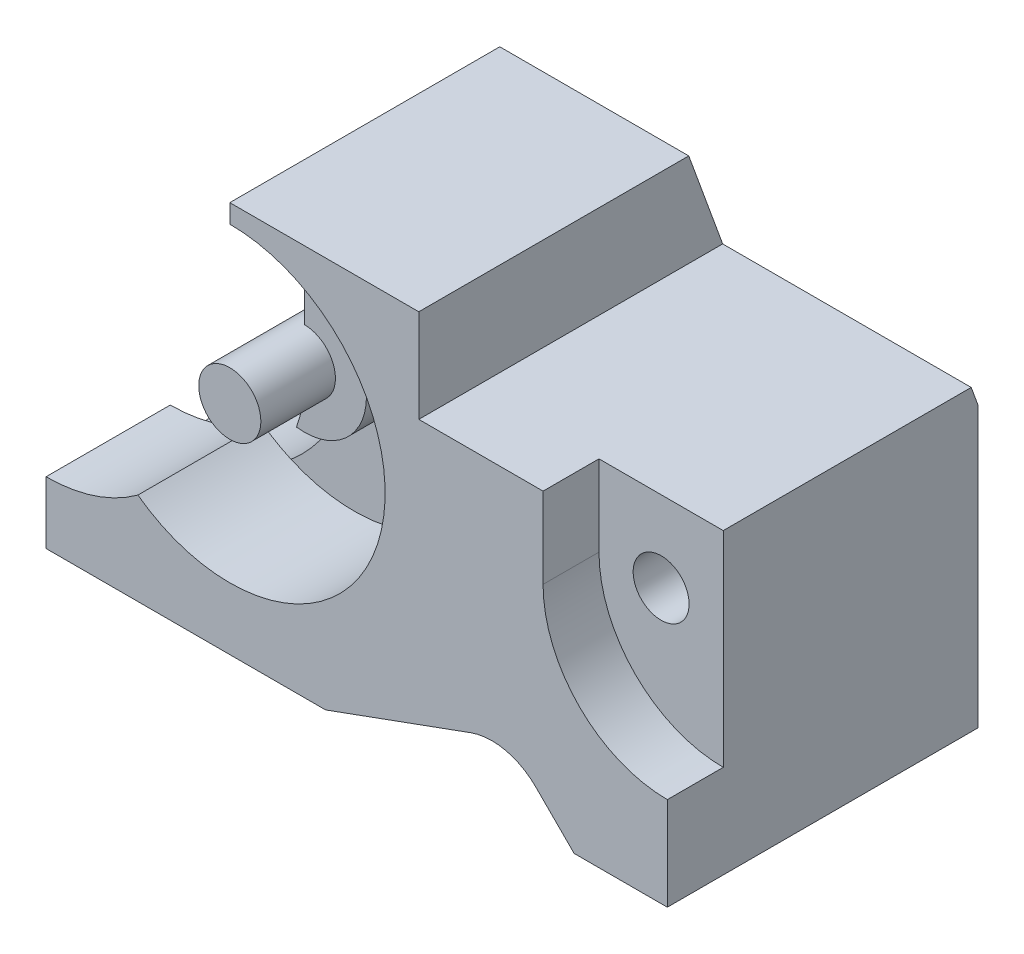
ISO-10303-21;
HEADER;
FILE_DESCRIPTION(('STEP AP214'),'2;1');
FILE_NAME('part.step','',(''),(''),'','','');
FILE_SCHEMA(('AUTOMOTIVE_DESIGN { 1 0 10303 214 1 1 1 1 }'));
ENDSEC;
DATA;
#1=APPLICATION_CONTEXT('core data for automotive mechanical design processes');
#2=APPLICATION_PROTOCOL_DEFINITION('international standard','automotive_design',2000,#1);
#3=PRODUCT_CONTEXT('',#1,'mechanical');
#4=PRODUCT('Part','Part','',(#3));
#5=PRODUCT_RELATED_PRODUCT_CATEGORY('part','',(#4));
#6=PRODUCT_DEFINITION_FORMATION('','',#4);
#7=PRODUCT_DEFINITION_CONTEXT('part definition',#1,'design');
#8=PRODUCT_DEFINITION('design','',#6,#7);
#9=PRODUCT_DEFINITION_SHAPE('','',#8);
#10=(LENGTH_UNIT() NAMED_UNIT(*) SI_UNIT(.MILLI.,.METRE.));
#11=(NAMED_UNIT(*) PLANE_ANGLE_UNIT() SI_UNIT($,.RADIAN.));
#12=(NAMED_UNIT(*) SI_UNIT($,.STERADIAN.) SOLID_ANGLE_UNIT());
#13=UNCERTAINTY_MEASURE_WITH_UNIT(LENGTH_MEASURE(1.E-05),#10,'distance_accuracy_value','');
#14=(GEOMETRIC_REPRESENTATION_CONTEXT(3) GLOBAL_UNCERTAINTY_ASSIGNED_CONTEXT((#13)) GLOBAL_UNIT_ASSIGNED_CONTEXT((#10,
#11,#12)) REPRESENTATION_CONTEXT('',''));
#15=CARTESIAN_POINT('',(0.,0.,0.));
#16=DIRECTION('',(0.,0.,1.));
#17=DIRECTION('',(1.,0.,0.));
#18=AXIS2_PLACEMENT_3D('',#15,#16,#17);
#19=CARTESIAN_POINT('',(0.,0.,50.));
#20=DIRECTION('',(-1.,0.,0.));
#21=DIRECTION('',(0.,0.,1.));
#22=AXIS2_PLACEMENT_3D('',#19,#20,#21);
#23=PLANE('',#22);
#24=DIRECTION('',(0.,-1.,0.));
#25=VECTOR('',#24,1.);
#26=CARTESIAN_POINT('',(2.61861100413235E-13,10.,30.));
#27=LINE('',#26,#25);
#28=CARTESIAN_POINT('',(0.,10.,30.));
#29=VERTEX_POINT('',#28);
#30=CARTESIAN_POINT('',(0.,5.,30.));
#31=VERTEX_POINT('',#30);
#32=EDGE_CURVE('E116',#29,#31,#27,.T.);
#33=ORIENTED_EDGE('',*,*,#32,.T.);
#34=DIRECTION('',(0.,0.,-1.));
#35=VECTOR('',#34,1.);
#36=CARTESIAN_POINT('',(0.,5.,30.));
#37=LINE('',#36,#35);
#38=CARTESIAN_POINT('',(0.,5.,0.));
#39=VERTEX_POINT('',#38);
#40=EDGE_CURVE('E454',#31,#39,#37,.T.);
#41=ORIENTED_EDGE('',*,*,#40,.T.);
#42=DIRECTION('',(0.,1.,0.));
#43=VECTOR('',#42,1.);
#44=CARTESIAN_POINT('',(0.,0.,0.));
#45=LINE('',#44,#43);
#46=CARTESIAN_POINT('',(0.,0.,0.));
#47=VERTEX_POINT('',#46);
#48=EDGE_CURVE('E423',#47,#39,#45,.T.);
#49=ORIENTED_EDGE('',*,*,#48,.F.);
#50=DIRECTION('',(0.,0.,-1.));
#51=VECTOR('',#50,1.);
#52=CARTESIAN_POINT('',(0.,0.,50.));
#53=LINE('',#52,#51);
#54=CARTESIAN_POINT('',(0.,0.,50.));
#55=VERTEX_POINT('',#54);
#56=EDGE_CURVE('E304',#55,#47,#53,.T.);
#57=ORIENTED_EDGE('',*,*,#56,.F.);
#58=DIRECTION('',(0.,1.,0.));
#59=VECTOR('',#58,1.);
#60=CARTESIAN_POINT('',(0.,0.,50.));
#61=LINE('',#60,#59);
#62=CARTESIAN_POINT('',(0.,10.,50.));
#63=VERTEX_POINT('',#62);
#64=EDGE_CURVE('E388',#55,#63,#61,.T.);
#65=ORIENTED_EDGE('',*,*,#64,.T.);
#66=DIRECTION('',(0.,0.,-1.));
#67=VECTOR('',#66,1.);
#68=CARTESIAN_POINT('',(0.,10.,50.));
#69=LINE('',#68,#67);
#70=EDGE_CURVE('E306',#63,#29,#69,.T.);
#71=ORIENTED_EDGE('',*,*,#70,.T.);
#72=EDGE_LOOP('',(#33,#41,#49,#57,#65,#71));
#73=FACE_BOUND('',#72,.T.);
#74=ADVANCED_FACE('F92',(#73),#23,.T.);
#75=CARTESIAN_POINT('',(0.,0.,0.));
#76=DIRECTION('',(0.,0.,1.));
#77=DIRECTION('',(1.,0.,0.));
#78=AXIS2_PLACEMENT_3D('',#75,#76,#77);
#79=PLANE('',#78);
#80=CARTESIAN_POINT('',(90.,35.,0.));
#81=DIRECTION('',(0.,0.,1.));
#82=DIRECTION('',(1.,0.,0.));
#83=AXIS2_PLACEMENT_3D('',#80,#81,#82);
#84=CIRCLE('',#83,4.50000000000001);
#85=CARTESIAN_POINT('',(94.5,35.,0.));
#86=VERTEX_POINT('',#85);
#87=EDGE_CURVE('E482',#86,#86,#84,.T.);
#88=ORIENTED_EDGE('',*,*,#87,.T.);
#89=EDGE_LOOP('',(#88));
#90=FACE_BOUND('',#89,.T.);
#91=DIRECTION('',(0.,1.,0.));
#92=VECTOR('',#91,1.);
#93=CARTESIAN_POINT('',(29.5803989154981,0.,0.));
#94=LINE('',#93,#92);
#95=CARTESIAN_POINT('',(29.5803989154981,40.,0.));
#96=VERTEX_POINT('',#95);
#97=CARTESIAN_POINT('',(29.5803989154981,45.,0.));
#98=VERTEX_POINT('',#97);
#99=EDGE_CURVE('E264',#96,#98,#94,.T.);
#100=ORIENTED_EDGE('',*,*,#99,.T.);
#101=DIRECTION('',(1.,0.,0.));
#102=VECTOR('',#101,1.);
#103=CARTESIAN_POINT('',(0.,45.,0.));
#104=LINE('',#103,#102);
#105=CARTESIAN_POINT('',(100.,45.,0.));
#106=VERTEX_POINT('',#105);
#107=EDGE_CURVE('E247',#98,#106,#104,.T.);
#108=ORIENTED_EDGE('',*,*,#107,.T.);
#109=DIRECTION('',(0.,-1.,0.));
#110=VECTOR('',#109,1.);
#111=CARTESIAN_POINT('',(100.,0.,0.));
#112=LINE('',#111,#110);
#113=CARTESIAN_POINT('',(100.,0.,0.));
#114=VERTEX_POINT('',#113);
#115=EDGE_CURVE('E265',#106,#114,#112,.T.);
#116=ORIENTED_EDGE('',*,*,#115,.T.);
#117=DIRECTION('',(-1.,0.,0.));
#118=VECTOR('',#117,1.);
#119=CARTESIAN_POINT('',(0.,0.,0.));
#120=LINE('',#119,#118);
#121=CARTESIAN_POINT('',(85.,0.,0.));
#122=VERTEX_POINT('',#121);
#123=EDGE_CURVE('E273',#114,#122,#120,.T.);
#124=ORIENTED_EDGE('',*,*,#123,.T.);
#125=DIRECTION('',(-0.707106781186553,0.707106781186542,0.));
#126=VECTOR('',#125,1.);
#127=CARTESIAN_POINT('',(42.4999999999994,42.5,0.));
#128=LINE('',#127,#126);
#129=CARTESIAN_POINT('',(78.8309201781926,6.16907982180732,0.));
#130=VERTEX_POINT('',#129);
#131=EDGE_CURVE('E283',#122,#130,#128,.T.);
#132=ORIENTED_EDGE('',*,*,#131,.T.);
#133=CARTESIAN_POINT('',(71.7598523663272,-0.901987990058188,0.));
#134=DIRECTION('',(0.,0.,1.));
#135=DIRECTION('',(1.,0.,0.));
#136=AXIS2_PLACEMENT_3D('',#133,#134,#135);
#137=CIRCLE('',#136,9.99999999999999);
#138=CARTESIAN_POINT('',(68.3396509330705,8.49493821780092,0.));
#139=VERTEX_POINT('',#138);
#140=EDGE_CURVE('E435',#139,#130,#137,.F.);
#141=ORIENTED_EDGE('',*,*,#140,.F.);
#142=DIRECTION('',(0.93969262078591,0.342020143325663,0.));
#143=VECTOR('',#142,1.);
#144=CARTESIAN_POINT('',(5.26400002982283,-14.4627212179469,0.));
#145=LINE('',#144,#143);
#146=CARTESIAN_POINT('',(45.,0.,0.));
#147=VERTEX_POINT('',#146);
#148=EDGE_CURVE('E427',#147,#139,#145,.T.);
#149=ORIENTED_EDGE('',*,*,#148,.F.);
#150=DIRECTION('',(1.,0.,0.));
#151=VECTOR('',#150,1.);
#152=CARTESIAN_POINT('',(0.,0.,0.));
#153=LINE('',#152,#151);
#154=EDGE_CURVE('E422',#47,#147,#153,.T.);
#155=ORIENTED_EDGE('',*,*,#154,.F.);
#156=ORIENTED_EDGE('',*,*,#48,.T.);
#157=CARTESIAN_POINT('',(0.,35.,0.));
#158=DIRECTION('',(0.,0.,1.));
#159=DIRECTION('',(1.,0.,0.));
#160=AXIS2_PLACEMENT_3D('',#157,#158,#159);
#161=CIRCLE('',#160,30.);
#162=CARTESIAN_POINT('',(29.5803989154981,30.,0.));
#163=VERTEX_POINT('',#162);
#164=EDGE_CURVE('E336',#163,#39,#161,.F.);
#165=ORIENTED_EDGE('',*,*,#164,.F.);
#166=CARTESIAN_POINT('',(29.5803989154981,35.,0.));
#167=DIRECTION('',(0.,0.,1.));
#168=DIRECTION('',(1.,0.,0.));
#169=AXIS2_PLACEMENT_3D('',#166,#167,#168);
#170=CIRCLE('',#169,5.);
#171=EDGE_CURVE('E372',#96,#163,#170,.T.);
#172=ORIENTED_EDGE('',*,*,#171,.F.);
#173=EDGE_LOOP('',(#100,#108,#116,#124,#132,#141,#149,#155,#156,#165,#172));
#174=FACE_BOUND('',#173,.T.);
#175=ADVANCED_FACE('F257',(#90,#174),#79,.F.);
#176=CARTESIAN_POINT('',(29.5803989154981,35.,50.));
#177=DIRECTION('',(0.,0.,-1.));
#178=DIRECTION('',(-1.,0.,0.));
#179=AXIS2_PLACEMENT_3D('',#176,#177,#178);
#180=CYLINDRICAL_SURFACE('',#179,25.);
#181=CARTESIAN_POINT('',(29.5803989154981,35.,30.));
#182=DIRECTION('',(0.,0.,1.));
#183=DIRECTION('',(1.,0.,0.));
#184=AXIS2_PLACEMENT_3D('',#181,#182,#183);
#185=CIRCLE('',#184,25.);
#186=CARTESIAN_POINT('',(19.4385478587559,12.1495545526382,30.));
#187=VERTEX_POINT('',#186);
#188=CARTESIAN_POINT('',(29.5803989154981,60.,30.));
#189=VERTEX_POINT('',#188);
#190=EDGE_CURVE('E478',#187,#189,#185,.T.);
#191=ORIENTED_EDGE('',*,*,#190,.F.);
#192=CARTESIAN_POINT('',(29.5803989154981,35.,30.));
#193=DIRECTION('',(0.,0.,-1.));
#194=DIRECTION('',(-1.,0.,0.));
#195=AXIS2_PLACEMENT_3D('',#192,#193,#194);
#196=CIRCLE('',#195,25.);
#197=CARTESIAN_POINT('',(14.790199457749,14.8443556292536,30.));
#198=VERTEX_POINT('',#197);
#199=EDGE_CURVE('E459',#187,#198,#196,.T.);
#200=ORIENTED_EDGE('',*,*,#199,.T.);
#201=DIRECTION('',(0.,0.,-1.));
#202=VECTOR('',#201,1.);
#203=CARTESIAN_POINT('',(14.790199457749,14.8443556292536,50.));
#204=LINE('',#203,#202);
#205=CARTESIAN_POINT('',(14.790199457749,14.8443556292536,50.));
#206=VERTEX_POINT('',#205);
#207=EDGE_CURVE('E315',#206,#198,#204,.T.);
#208=ORIENTED_EDGE('',*,*,#207,.F.);
#209=CARTESIAN_POINT('',(29.5803989154981,35.,50.));
#210=DIRECTION('',(0.,0.,1.));
#211=DIRECTION('',(1.,0.,0.));
#212=AXIS2_PLACEMENT_3D('',#209,#210,#211);
#213=CIRCLE('',#212,25.);
#214=CARTESIAN_POINT('',(29.5803989154981,60.,50.));
#215=VERTEX_POINT('',#214);
#216=EDGE_CURVE('E405',#206,#215,#213,.T.);
#217=ORIENTED_EDGE('',*,*,#216,.T.);
#218=DIRECTION('',(0.,0.,-1.));
#219=VECTOR('',#218,1.);
#220=CARTESIAN_POINT('',(29.5803989154981,60.,50.));
#221=LINE('',#220,#219);
#222=EDGE_CURVE('E316',#215,#189,#221,.T.);
#223=ORIENTED_EDGE('',*,*,#222,.T.);
#224=EDGE_LOOP('',(#191,#200,#208,#217,#223));
#225=FACE_BOUND('',#224,.T.);
#226=ADVANCED_FACE('F535',(#225),#180,.F.);
#227=CARTESIAN_POINT('',(0.,35.,50.));
#228=DIRECTION('',(0.,0.,-1.));
#229=DIRECTION('',(-1.,0.,0.));
#230=AXIS2_PLACEMENT_3D('',#227,#228,#229);
#231=CYLINDRICAL_SURFACE('',#230,25.);
#232=ORIENTED_EDGE('',*,*,#207,.T.);
#233=CARTESIAN_POINT('',(0.,35.,30.));
#234=DIRECTION('',(0.,0.,-1.));
#235=DIRECTION('',(-1.,0.,0.));
#236=AXIS2_PLACEMENT_3D('',#233,#234,#235);
#237=CIRCLE('',#236,25.);
#238=EDGE_CURVE('E102',#198,#29,#237,.T.);
#239=ORIENTED_EDGE('',*,*,#238,.T.);
#240=ORIENTED_EDGE('',*,*,#70,.F.);
#241=CARTESIAN_POINT('',(0.,35.,50.));
#242=DIRECTION('',(0.,0.,1.));
#243=DIRECTION('',(1.,0.,0.));
#244=AXIS2_PLACEMENT_3D('',#241,#242,#243);
#245=CIRCLE('',#244,25.);
#246=EDGE_CURVE('E396',#63,#206,#245,.T.);
#247=ORIENTED_EDGE('',*,*,#246,.T.);
#248=EDGE_LOOP('',(#232,#239,#240,#247));
#249=FACE_BOUND('',#248,.T.);
#250=ADVANCED_FACE('F385',(#249),#231,.F.);
#251=CARTESIAN_POINT('',(29.5803989154981,35.,50.));
#252=DIRECTION('',(0.,0.,-1.));
#253=DIRECTION('',(-1.,0.,0.));
#254=AXIS2_PLACEMENT_3D('',#251,#252,#253);
#255=CYLINDRICAL_SURFACE('',#254,5.);
#256=ORIENTED_EDGE('',*,*,#171,.T.);
#257=DIRECTION('',(0.,0.,-1.));
#258=VECTOR('',#257,1.);
#259=CARTESIAN_POINT('',(29.5803989154981,30.,38.));
#260=LINE('',#259,#258);
#261=CARTESIAN_POINT('',(29.5803989154981,30.,38.));
#262=VERTEX_POINT('',#261);
#263=EDGE_CURVE('E354',#262,#163,#260,.T.);
#264=ORIENTED_EDGE('',*,*,#263,.F.);
#265=CARTESIAN_POINT('',(29.5803989154981,35.,38.));
#266=DIRECTION('',(0.,0.,1.));
#267=DIRECTION('',(1.,0.,0.));
#268=AXIS2_PLACEMENT_3D('',#265,#266,#267);
#269=CIRCLE('',#268,5.);
#270=CARTESIAN_POINT('',(29.5803989154981,40.,38.));
#271=VERTEX_POINT('',#270);
#272=EDGE_CURVE('E348',#262,#271,#269,.T.);
#273=ORIENTED_EDGE('',*,*,#272,.T.);
#274=DIRECTION('',(0.,0.,-1.));
#275=VECTOR('',#274,1.);
#276=CARTESIAN_POINT('',(29.5803989154981,40.,38.));
#277=LINE('',#276,#275);
#278=EDGE_CURVE('E362',#271,#96,#277,.T.);
#279=ORIENTED_EDGE('',*,*,#278,.T.);
#280=EDGE_LOOP('',(#256,#264,#273,#279));
#281=FACE_BOUND('',#280,.T.);
#282=CARTESIAN_POINT('',(29.5803989154981,35.,50.));
#283=DIRECTION('',(0.,0.,1.));
#284=DIRECTION('',(1.,0.,0.));
#285=AXIS2_PLACEMENT_3D('',#282,#283,#284);
#286=CIRCLE('',#285,5.);
#287=CARTESIAN_POINT('',(34.5803989154981,35.,50.));
#288=VERTEX_POINT('',#287);
#289=EDGE_CURVE('E374',#288,#288,#286,.T.);
#290=ORIENTED_EDGE('',*,*,#289,.F.);
#291=EDGE_LOOP('',(#290));
#292=FACE_BOUND('',#291,.T.);
#293=ADVANCED_FACE('F100',(#281,#292),#255,.T.);
#294=CARTESIAN_POINT('',(0.,0.,50.));
#295=DIRECTION('',(0.,0.,1.));
#296=DIRECTION('',(1.,0.,0.));
#297=AXIS2_PLACEMENT_3D('',#294,#295,#296);
#298=PLANE('',#297);
#299=ORIENTED_EDGE('',*,*,#289,.T.);
#300=EDGE_LOOP('',(#299));
#301=FACE_BOUND('',#300,.T.);
#302=ADVANCED_FACE('F602',(#301),#298,.T.);
#303=CARTESIAN_POINT('',(0.,35.,38.));
#304=DIRECTION('',(0.,0.,-1.));
#305=DIRECTION('',(-1.,0.,0.));
#306=AXIS2_PLACEMENT_3D('',#303,#304,#305);
#307=CYLINDRICAL_SURFACE('',#306,30.);
#308=CARTESIAN_POINT('',(0.,35.,30.));
#309=DIRECTION('',(0.,0.,1.));
#310=DIRECTION('',(1.,0.,0.));
#311=AXIS2_PLACEMENT_3D('',#308,#309,#310);
#312=CIRCLE('',#311,30.);
#313=CARTESIAN_POINT('',(28.3126675334053,25.0806826271735,30.));
#314=VERTEX_POINT('',#313);
#315=EDGE_CURVE('E472',#314,#187,#312,.F.);
#316=ORIENTED_EDGE('',*,*,#315,.F.);
#317=DIRECTION('',(0.,0.,-1.));
#318=VECTOR('',#317,1.);
#319=CARTESIAN_POINT('',(28.3126675334053,25.0806826271735,38.));
#320=LINE('',#319,#318);
#321=CARTESIAN_POINT('',(28.3126675334053,25.0806826271735,38.));
#322=VERTEX_POINT('',#321);
#323=EDGE_CURVE('E367',#322,#314,#320,.T.);
#324=ORIENTED_EDGE('',*,*,#323,.F.);
#325=CARTESIAN_POINT('',(0.,35.,38.));
#326=DIRECTION('',(0.,0.,1.));
#327=DIRECTION('',(1.,0.,0.));
#328=AXIS2_PLACEMENT_3D('',#325,#326,#327);
#329=CIRCLE('',#328,30.);
#330=EDGE_CURVE('E339',#262,#322,#329,.F.);
#331=ORIENTED_EDGE('',*,*,#330,.F.);
#332=ORIENTED_EDGE('',*,*,#263,.T.);
#333=ORIENTED_EDGE('',*,*,#164,.T.);
#334=ORIENTED_EDGE('',*,*,#40,.F.);
#335=CARTESIAN_POINT('',(0.,35.,30.));
#336=DIRECTION('',(0.,0.,1.));
#337=DIRECTION('',(-1.,0.,0.));
#338=AXIS2_PLACEMENT_3D('',#335,#336,#337);
#339=CIRCLE('',#338,30.);
#340=EDGE_CURVE('E458',#31,#187,#339,.T.);
#341=ORIENTED_EDGE('',*,*,#340,.T.);
#342=EDGE_LOOP('',(#316,#324,#331,#332,#333,#334,#341));
#343=FACE_BOUND('',#342,.T.);
#344=ADVANCED_FACE('F546',(#343),#307,.F.);
#345=CARTESIAN_POINT('',(29.5803989154981,35.,38.));
#346=DIRECTION('',(0.,0.,-1.));
#347=DIRECTION('',(-1.,0.,0.));
#348=AXIS2_PLACEMENT_3D('',#345,#346,#347);
#349=CYLINDRICAL_SURFACE('',#348,10.);
#350=ORIENTED_EDGE('',*,*,#323,.T.);
#351=CARTESIAN_POINT('',(29.5803989154981,35.,30.));
#352=DIRECTION('',(0.,0.,1.));
#353=DIRECTION('',(1.,0.,0.));
#354=AXIS2_PLACEMENT_3D('',#351,#352,#353);
#355=CIRCLE('',#354,10.);
#356=CARTESIAN_POINT('',(29.5803989154981,45.,30.));
#357=VERTEX_POINT('',#356);
#358=EDGE_CURVE('E464',#314,#357,#355,.T.);
#359=ORIENTED_EDGE('',*,*,#358,.T.);
#360=DIRECTION('',(0.,0.,-1.));
#361=VECTOR('',#360,1.);
#362=CARTESIAN_POINT('',(29.5803989154981,45.,38.));
#363=LINE('',#362,#361);
#364=CARTESIAN_POINT('',(29.5803989154981,45.,38.));
#365=VERTEX_POINT('',#364);
#366=EDGE_CURVE('E368',#365,#357,#363,.T.);
#367=ORIENTED_EDGE('',*,*,#366,.F.);
#368=CARTESIAN_POINT('',(29.5803989154981,35.,38.));
#369=DIRECTION('',(0.,0.,1.));
#370=DIRECTION('',(1.,0.,0.));
#371=AXIS2_PLACEMENT_3D('',#368,#369,#370);
#372=CIRCLE('',#371,10.);
#373=EDGE_CURVE('E343',#322,#365,#372,.T.);
#374=ORIENTED_EDGE('',*,*,#373,.F.);
#375=EDGE_LOOP('',(#350,#359,#367,#374));
#376=FACE_BOUND('',#375,.T.);
#377=ADVANCED_FACE('F542',(#376),#349,.T.);
#378=CARTESIAN_POINT('',(29.5803989154981,0.,38.));
#379=DIRECTION('',(-1.,0.,0.));
#380=DIRECTION('',(0.,-1.,0.));
#381=AXIS2_PLACEMENT_3D('',#378,#379,#380);
#382=PLANE('',#381);
#383=DIRECTION('',(0.,0.939692620785908,0.342020143325669));
#384=VECTOR('',#383,1.);
#385=CARTESIAN_POINT('',(29.5803989154981,17.4769646138673,-10.0175656372077));
#386=LINE('',#385,#384);
#387=CARTESIAN_POINT('',(29.5803989154981,63.,6.55146421679165));
#388=VERTEX_POINT('',#387);
#389=EDGE_CURVE('E616',#98,#388,#386,.T.);
#390=ORIENTED_EDGE('',*,*,#389,.F.);
#391=ORIENTED_EDGE('',*,*,#99,.F.);
#392=ORIENTED_EDGE('',*,*,#278,.F.);
#393=DIRECTION('',(0.,1.,0.));
#394=VECTOR('',#393,1.);
#395=CARTESIAN_POINT('',(29.5803989154981,0.,38.));
#396=LINE('',#395,#394);
#397=EDGE_CURVE('E347',#271,#365,#396,.T.);
#398=ORIENTED_EDGE('',*,*,#397,.T.);
#399=ORIENTED_EDGE('',*,*,#366,.T.);
#400=DIRECTION('',(0.,1.,0.));
#401=VECTOR('',#400,1.);
#402=CARTESIAN_POINT('',(29.5803989154981,0.,30.));
#403=LINE('',#402,#401);
#404=EDGE_CURVE('E477',#357,#189,#403,.T.);
#405=ORIENTED_EDGE('',*,*,#404,.T.);
#406=ORIENTED_EDGE('',*,*,#222,.F.);
#407=DIRECTION('',(0.,1.,0.));
#408=VECTOR('',#407,1.);
#409=CARTESIAN_POINT('',(29.5803989154979,0.,50.));
#410=LINE('',#409,#408);
#411=CARTESIAN_POINT('',(29.5803989154981,63.,50.));
#412=VERTEX_POINT('',#411);
#413=EDGE_CURVE('E522',#215,#412,#410,.T.);
#414=ORIENTED_EDGE('',*,*,#413,.T.);
#415=DIRECTION('',(0.,0.,-1.));
#416=VECTOR('',#415,1.);
#417=CARTESIAN_POINT('',(29.5803989154981,63.,50.));
#418=LINE('',#417,#416);
#419=EDGE_CURVE('E317',#412,#388,#418,.T.);
#420=ORIENTED_EDGE('',*,*,#419,.T.);
#421=EDGE_LOOP('',(#390,#391,#392,#398,#399,#405,#406,#414,#420));
#422=FACE_BOUND('',#421,.T.);
#423=ADVANCED_FACE('F538',(#422),#382,.T.);
#424=CARTESIAN_POINT('',(0.,0.,38.));
#425=DIRECTION('',(0.,0.,1.));
#426=DIRECTION('',(1.,0.,0.));
#427=AXIS2_PLACEMENT_3D('',#424,#425,#426);
#428=PLANE('',#427);
#429=ORIENTED_EDGE('',*,*,#330,.T.);
#430=ORIENTED_EDGE('',*,*,#373,.T.);
#431=ORIENTED_EDGE('',*,*,#397,.F.);
#432=ORIENTED_EDGE('',*,*,#272,.F.);
#433=EDGE_LOOP('',(#429,#430,#431,#432));
#434=FACE_BOUND('',#433,.T.);
#435=ADVANCED_FACE('F595',(#434),#428,.T.);
#436=CARTESIAN_POINT('',(100.,35.,50.));
#437=DIRECTION('',(0.,0.,-1.));
#438=DIRECTION('',(-1.,0.,0.));
#439=AXIS2_PLACEMENT_3D('',#436,#437,#438);
#440=CYLINDRICAL_SURFACE('',#439,20.);
#441=CARTESIAN_POINT('',(100.,35.,41.));
#442=DIRECTION('',(0.,0.,1.));
#443=DIRECTION('',(1.,0.,0.));
#444=AXIS2_PLACEMENT_3D('',#441,#442,#443);
#445=CIRCLE('',#444,20.);
#446=CARTESIAN_POINT('',(80.,35.,41.));
#447=VERTEX_POINT('',#446);
#448=CARTESIAN_POINT('',(100.,15.,41.));
#449=VERTEX_POINT('',#448);
#450=EDGE_CURVE('E492',#447,#449,#445,.T.);
#451=ORIENTED_EDGE('',*,*,#450,.F.);
#452=DIRECTION('',(0.,0.,-1.));
#453=VECTOR('',#452,1.);
#454=CARTESIAN_POINT('',(80.,35.,50.));
#455=LINE('',#454,#453);
#456=CARTESIAN_POINT('',(80.,35.,50.));
#457=VERTEX_POINT('',#456);
#458=EDGE_CURVE('E333',#457,#447,#455,.T.);
#459=ORIENTED_EDGE('',*,*,#458,.F.);
#460=CARTESIAN_POINT('',(100.,35.,50.));
#461=DIRECTION('',(0.,0.,1.));
#462=DIRECTION('',(1.,0.,0.));
#463=AXIS2_PLACEMENT_3D('',#460,#461,#462);
#464=CIRCLE('',#463,20.);
#465=CARTESIAN_POINT('',(100.,15.,50.));
#466=VERTEX_POINT('',#465);
#467=EDGE_CURVE('E272',#457,#466,#464,.T.);
#468=ORIENTED_EDGE('',*,*,#467,.T.);
#469=DIRECTION('',(0.,0.,-1.));
#470=VECTOR('',#469,1.);
#471=CARTESIAN_POINT('',(100.,15.,50.));
#472=LINE('',#471,#470);
#473=EDGE_CURVE('E282',#466,#449,#472,.T.);
#474=ORIENTED_EDGE('',*,*,#473,.T.);
#475=EDGE_LOOP('',(#451,#459,#468,#474));
#476=FACE_BOUND('',#475,.T.);
#477=ADVANCED_FACE('F586',(#476),#440,.F.);
#478=CARTESIAN_POINT('',(80.,0.,50.));
#479=DIRECTION('',(1.,0.,0.));
#480=DIRECTION('',(0.,0.,-1.));
#481=AXIS2_PLACEMENT_3D('',#478,#479,#480);
#482=PLANE('',#481);
#483=DIRECTION('',(0.,-1.,0.));
#484=VECTOR('',#483,1.);
#485=CARTESIAN_POINT('',(80.,0.,41.));
#486=LINE('',#485,#484);
#487=CARTESIAN_POINT('',(80.,48.,41.));
#488=VERTEX_POINT('',#487);
#489=EDGE_CURVE('E487',#488,#447,#486,.T.);
#490=ORIENTED_EDGE('',*,*,#489,.F.);
#491=DIRECTION('',(0.,0.,-1.));
#492=VECTOR('',#491,1.);
#493=CARTESIAN_POINT('',(80.,48.,50.));
#494=LINE('',#493,#492);
#495=CARTESIAN_POINT('',(80.,48.,50.));
#496=VERTEX_POINT('',#495);
#497=EDGE_CURVE('E332',#496,#488,#494,.T.);
#498=ORIENTED_EDGE('',*,*,#497,.F.);
#499=DIRECTION('',(0.,-1.,0.));
#500=VECTOR('',#499,1.);
#501=CARTESIAN_POINT('',(80.,0.,50.));
#502=LINE('',#501,#500);
#503=EDGE_CURVE('E276',#496,#457,#502,.T.);
#504=ORIENTED_EDGE('',*,*,#503,.T.);
#505=ORIENTED_EDGE('',*,*,#458,.T.);
#506=EDGE_LOOP('',(#490,#498,#504,#505));
#507=FACE_BOUND('',#506,.T.);
#508=ADVANCED_FACE('F585',(#507),#482,.T.);
#509=CARTESIAN_POINT('',(0.,48.,50.));
#510=DIRECTION('',(0.,1.,0.));
#511=DIRECTION('',(0.,0.,1.));
#512=AXIS2_PLACEMENT_3D('',#509,#510,#511);
#513=PLANE('',#512);
#514=DIRECTION('',(1.,0.,0.));
#515=VECTOR('',#514,1.);
#516=CARTESIAN_POINT('',(0.,48.,1.09191070279861));
#517=LINE('',#516,#515);
#518=CARTESIAN_POINT('',(60.,48.,1.09191070279861));
#519=VERTEX_POINT('',#518);
#520=CARTESIAN_POINT('',(100.,48.,1.09191070279861));
#521=VERTEX_POINT('',#520);
#522=EDGE_CURVE('E252',#519,#521,#517,.T.);
#523=ORIENTED_EDGE('',*,*,#522,.F.);
#524=DIRECTION('',(0.,0.,-1.));
#525=VECTOR('',#524,1.);
#526=CARTESIAN_POINT('',(60.,48.,50.));
#527=LINE('',#526,#525);
#528=CARTESIAN_POINT('',(60.,48.,50.));
#529=VERTEX_POINT('',#528);
#530=EDGE_CURVE('E330',#529,#519,#527,.T.);
#531=ORIENTED_EDGE('',*,*,#530,.F.);
#532=DIRECTION('',(1.,0.,0.));
#533=VECTOR('',#532,1.);
#534=CARTESIAN_POINT('',(0.,48.,50.));
#535=LINE('',#534,#533);
#536=EDGE_CURVE('E511',#529,#496,#535,.T.);
#537=ORIENTED_EDGE('',*,*,#536,.T.);
#538=ORIENTED_EDGE('',*,*,#497,.T.);
#539=DIRECTION('',(1.,0.,0.));
#540=VECTOR('',#539,1.);
#541=CARTESIAN_POINT('',(0.,48.,41.));
#542=LINE('',#541,#540);
#543=CARTESIAN_POINT('',(100.,48.,41.));
#544=VERTEX_POINT('',#543);
#545=EDGE_CURVE('E503',#488,#544,#542,.T.);
#546=ORIENTED_EDGE('',*,*,#545,.T.);
#547=DIRECTION('',(0.,0.,-1.));
#548=VECTOR('',#547,1.);
#549=CARTESIAN_POINT('',(100.,48.,41.));
#550=LINE('',#549,#548);
#551=EDGE_CURVE('E426',#544,#521,#550,.T.);
#552=ORIENTED_EDGE('',*,*,#551,.T.);
#553=EDGE_LOOP('',(#523,#531,#537,#538,#546,#552));
#554=FACE_BOUND('',#553,.T.);
#555=ADVANCED_FACE('F579',(#554),#513,.T.);
#556=CARTESIAN_POINT('',(60.,0.,50.));
#557=DIRECTION('',(-1.,0.,0.));
#558=DIRECTION('',(0.,0.,1.));
#559=AXIS2_PLACEMENT_3D('',#556,#557,#558);
#560=PLANE('',#559);
#561=ORIENTED_EDGE('',*,*,#530,.T.);
#562=DIRECTION('',(0.,0.939692620785908,0.342020143325669));
#563=VECTOR('',#562,1.);
#564=CARTESIAN_POINT('',(60.,21.3336902719865,-8.61383229592159));
#565=LINE('',#564,#563);
#566=CARTESIAN_POINT('',(60.,63.,6.55146421679165));
#567=VERTEX_POINT('',#566);
#568=EDGE_CURVE('E12',#519,#567,#565,.T.);
#569=ORIENTED_EDGE('',*,*,#568,.T.);
#570=DIRECTION('',(0.,0.,-1.));
#571=VECTOR('',#570,1.);
#572=CARTESIAN_POINT('',(60.,63.,50.));
#573=LINE('',#572,#571);
#574=CARTESIAN_POINT('',(60.,63.,50.));
#575=VERTEX_POINT('',#574);
#576=EDGE_CURVE('E323',#575,#567,#573,.T.);
#577=ORIENTED_EDGE('',*,*,#576,.F.);
#578=DIRECTION('',(0.,1.,0.));
#579=VECTOR('',#578,1.);
#580=CARTESIAN_POINT('',(60.,0.,50.));
#581=LINE('',#580,#579);
#582=EDGE_CURVE('E520',#529,#575,#581,.T.);
#583=ORIENTED_EDGE('',*,*,#582,.F.);
#584=EDGE_LOOP('',(#561,#569,#577,#583));
#585=FACE_BOUND('',#584,.T.);
#586=ADVANCED_FACE('F576',(#585),#560,.F.);
#587=CARTESIAN_POINT('',(0.,63.,50.));
#588=DIRECTION('',(0.,1.,0.));
#589=DIRECTION('',(0.,0.,1.));
#590=AXIS2_PLACEMENT_3D('',#587,#588,#589);
#591=PLANE('',#590);
#592=DIRECTION('',(1.,0.,0.));
#593=VECTOR('',#592,1.);
#594=CARTESIAN_POINT('',(0.,63.,6.55146421679165));
#595=LINE('',#594,#593);
#596=EDGE_CURVE('E112',#388,#567,#595,.T.);
#597=ORIENTED_EDGE('',*,*,#596,.F.);
#598=ORIENTED_EDGE('',*,*,#419,.F.);
#599=DIRECTION('',(1.,0.,0.));
#600=VECTOR('',#599,1.);
#601=CARTESIAN_POINT('',(0.,63.,50.));
#602=LINE('',#601,#600);
#603=EDGE_CURVE('E517',#412,#575,#602,.T.);
#604=ORIENTED_EDGE('',*,*,#603,.T.);
#605=ORIENTED_EDGE('',*,*,#576,.T.);
#606=EDGE_LOOP('',(#597,#598,#604,#605));
#607=FACE_BOUND('',#606,.T.);
#608=ADVANCED_FACE('F571',(#607),#591,.T.);
#609=CARTESIAN_POINT('',(0.,0.,50.));
#610=DIRECTION('',(0.,1.,0.));
#611=DIRECTION('',(0.,0.,1.));
#612=AXIS2_PLACEMENT_3D('',#609,#610,#611);
#613=PLANE('',#612);
#614=ORIENTED_EDGE('',*,*,#154,.T.);
#615=DIRECTION('',(0.,0.,-1.));
#616=VECTOR('',#615,1.);
#617=CARTESIAN_POINT('',(45.,0.,50.));
#618=LINE('',#617,#616);
#619=CARTESIAN_POINT('',(45.,0.,50.));
#620=VERTEX_POINT('',#619);
#621=EDGE_CURVE('E301',#620,#147,#618,.T.);
#622=ORIENTED_EDGE('',*,*,#621,.F.);
#623=DIRECTION('',(1.,0.,0.));
#624=VECTOR('',#623,1.);
#625=CARTESIAN_POINT('',(0.,0.,50.));
#626=LINE('',#625,#624);
#627=EDGE_CURVE('E392',#55,#620,#626,.T.);
#628=ORIENTED_EDGE('',*,*,#627,.F.);
#629=ORIENTED_EDGE('',*,*,#56,.T.);
#630=EDGE_LOOP('',(#614,#622,#628,#629));
#631=FACE_BOUND('',#630,.T.);
#632=ADVANCED_FACE('F566',(#631),#613,.F.);
#633=CARTESIAN_POINT('',(5.26400002982283,-14.4627212179469,50.));
#634=DIRECTION('',(-0.342020143325663,0.93969262078591,0.));
#635=DIRECTION('',(-0.93969262078591,-0.342020143325663,0.));
#636=AXIS2_PLACEMENT_3D('',#633,#634,#635);
#637=PLANE('',#636);
#638=ORIENTED_EDGE('',*,*,#148,.T.);
#639=DIRECTION('',(0.,0.,-1.));
#640=VECTOR('',#639,1.);
#641=CARTESIAN_POINT('',(68.3396509330705,8.49493821780092,50.));
#642=LINE('',#641,#640);
#643=CARTESIAN_POINT('',(68.3396509330705,8.49493821780092,50.));
#644=VERTEX_POINT('',#643);
#645=EDGE_CURVE('E300',#644,#139,#642,.T.);
#646=ORIENTED_EDGE('',*,*,#645,.F.);
#647=DIRECTION('',(0.93969262078591,0.342020143325663,0.));
#648=VECTOR('',#647,1.);
#649=CARTESIAN_POINT('',(5.26400002982283,-14.4627212179469,50.));
#650=LINE('',#649,#648);
#651=EDGE_CURVE('E399',#620,#644,#650,.T.);
#652=ORIENTED_EDGE('',*,*,#651,.F.);
#653=ORIENTED_EDGE('',*,*,#621,.T.);
#654=EDGE_LOOP('',(#638,#646,#652,#653));
#655=FACE_BOUND('',#654,.T.);
#656=ADVANCED_FACE('F447',(#655),#637,.F.);
#657=CARTESIAN_POINT('',(71.7598523663272,-0.901987990058188,50.));
#658=DIRECTION('',(0.,0.,-1.));
#659=DIRECTION('',(-1.,0.,0.));
#660=AXIS2_PLACEMENT_3D('',#657,#658,#659);
#661=CYLINDRICAL_SURFACE('',#660,9.99999999999999);
#662=ORIENTED_EDGE('',*,*,#140,.T.);
#663=DIRECTION('',(0.,0.,-1.));
#664=VECTOR('',#663,1.);
#665=CARTESIAN_POINT('',(78.8309201781926,6.16907982180732,50.));
#666=LINE('',#665,#664);
#667=CARTESIAN_POINT('',(78.8309201781926,6.16907982180732,50.));
#668=VERTEX_POINT('',#667);
#669=EDGE_CURVE('E294',#668,#130,#666,.T.);
#670=ORIENTED_EDGE('',*,*,#669,.F.);
#671=CARTESIAN_POINT('',(71.7598523663272,-0.901987990058188,50.));
#672=DIRECTION('',(0.,0.,1.));
#673=DIRECTION('',(1.,0.,0.));
#674=AXIS2_PLACEMENT_3D('',#671,#672,#673);
#675=CIRCLE('',#674,9.99999999999999);
#676=EDGE_CURVE('E406',#644,#668,#675,.F.);
#677=ORIENTED_EDGE('',*,*,#676,.F.);
#678=ORIENTED_EDGE('',*,*,#645,.T.);
#679=EDGE_LOOP('',(#662,#670,#677,#678));
#680=FACE_BOUND('',#679,.T.);
#681=ADVANCED_FACE('F448',(#680),#661,.F.);
#682=CARTESIAN_POINT('',(42.4999999999994,42.5,50.));
#683=DIRECTION('',(-0.707106781186543,-0.707106781186553,0.));
#684=DIRECTION('',(0.707106781186553,-0.707106781186542,0.));
#685=AXIS2_PLACEMENT_3D('',#682,#683,#684);
#686=PLANE('',#685);
#687=ORIENTED_EDGE('',*,*,#131,.F.);
#688=DIRECTION('',(0.,0.,-1.));
#689=VECTOR('',#688,1.);
#690=CARTESIAN_POINT('',(85.,0.,50.));
#691=LINE('',#690,#689);
#692=CARTESIAN_POINT('',(85.,0.,50.));
#693=VERTEX_POINT('',#692);
#694=EDGE_CURVE('E292',#693,#122,#691,.T.);
#695=ORIENTED_EDGE('',*,*,#694,.F.);
#696=DIRECTION('',(-0.707106781186553,0.707106781186542,0.));
#697=VECTOR('',#696,1.);
#698=CARTESIAN_POINT('',(42.4999999999994,42.5,50.));
#699=LINE('',#698,#697);
#700=EDGE_CURVE('E411',#693,#668,#699,.T.);
#701=ORIENTED_EDGE('',*,*,#700,.T.);
#702=ORIENTED_EDGE('',*,*,#669,.T.);
#703=EDGE_LOOP('',(#687,#695,#701,#702));
#704=FACE_BOUND('',#703,.T.);
#705=ADVANCED_FACE('F442',(#704),#686,.T.);
#706=CARTESIAN_POINT('',(0.,0.,50.));
#707=DIRECTION('',(0.,-1.,0.));
#708=DIRECTION('',(1.,0.,0.));
#709=AXIS2_PLACEMENT_3D('',#706,#707,#708);
#710=PLANE('',#709);
#711=ORIENTED_EDGE('',*,*,#123,.F.);
#712=DIRECTION('',(0.,0.,-1.));
#713=VECTOR('',#712,1.);
#714=CARTESIAN_POINT('',(100.,0.,50.));
#715=LINE('',#714,#713);
#716=CARTESIAN_POINT('',(100.,0.,50.));
#717=VERTEX_POINT('',#716);
#718=EDGE_CURVE('E269',#717,#114,#715,.T.);
#719=ORIENTED_EDGE('',*,*,#718,.F.);
#720=DIRECTION('',(-1.,0.,0.));
#721=VECTOR('',#720,1.);
#722=CARTESIAN_POINT('',(0.,0.,50.));
#723=LINE('',#722,#721);
#724=EDGE_CURVE('E414',#717,#693,#723,.T.);
#725=ORIENTED_EDGE('',*,*,#724,.T.);
#726=ORIENTED_EDGE('',*,*,#694,.T.);
#727=EDGE_LOOP('',(#711,#719,#725,#726));
#728=FACE_BOUND('',#727,.T.);
#729=ADVANCED_FACE('F634',(#728),#710,.T.);
#730=CARTESIAN_POINT('',(100.,0.,50.));
#731=DIRECTION('',(1.,0.,0.));
#732=DIRECTION('',(0.,0.,-1.));
#733=AXIS2_PLACEMENT_3D('',#730,#731,#732);
#734=PLANE('',#733);
#735=DIRECTION('',(0.,-0.939692620785908,-0.342020143325669));
#736=VECTOR('',#735,1.);
#737=CARTESIAN_POINT('',(100.,45.,0.));
#738=LINE('',#737,#736);
#739=EDGE_CURVE('E246',#521,#106,#738,.T.);
#740=ORIENTED_EDGE('',*,*,#739,.F.);
#741=ORIENTED_EDGE('',*,*,#551,.F.);
#742=DIRECTION('',(0.,-1.,0.));
#743=VECTOR('',#742,1.);
#744=CARTESIAN_POINT('',(100.,0.,41.));
#745=LINE('',#744,#743);
#746=EDGE_CURVE('E500',#544,#449,#745,.T.);
#747=ORIENTED_EDGE('',*,*,#746,.T.);
#748=ORIENTED_EDGE('',*,*,#473,.F.);
#749=DIRECTION('',(0.,-1.,0.));
#750=VECTOR('',#749,1.);
#751=CARTESIAN_POINT('',(100.,0.,50.));
#752=LINE('',#751,#750);
#753=EDGE_CURVE('E288',#466,#717,#752,.T.);
#754=ORIENTED_EDGE('',*,*,#753,.T.);
#755=ORIENTED_EDGE('',*,*,#718,.T.);
#756=ORIENTED_EDGE('',*,*,#115,.F.);
#757=EDGE_LOOP('',(#740,#741,#747,#748,#754,#755,#756));
#758=FACE_BOUND('',#757,.T.);
#759=ADVANCED_FACE('F268',(#758),#734,.T.);
#760=CARTESIAN_POINT('',(0.,0.,50.));
#761=DIRECTION('',(0.,0.,1.));
#762=DIRECTION('',(1.,0.,0.));
#763=AXIS2_PLACEMENT_3D('',#760,#761,#762);
#764=PLANE('',#763);
#765=ORIENTED_EDGE('',*,*,#467,.F.);
#766=ORIENTED_EDGE('',*,*,#503,.F.);
#767=ORIENTED_EDGE('',*,*,#536,.F.);
#768=ORIENTED_EDGE('',*,*,#582,.T.);
#769=ORIENTED_EDGE('',*,*,#603,.F.);
#770=ORIENTED_EDGE('',*,*,#413,.F.);
#771=ORIENTED_EDGE('',*,*,#216,.F.);
#772=ORIENTED_EDGE('',*,*,#246,.F.);
#773=ORIENTED_EDGE('',*,*,#64,.F.);
#774=ORIENTED_EDGE('',*,*,#627,.T.);
#775=ORIENTED_EDGE('',*,*,#651,.T.);
#776=ORIENTED_EDGE('',*,*,#676,.T.);
#777=ORIENTED_EDGE('',*,*,#700,.F.);
#778=ORIENTED_EDGE('',*,*,#724,.F.);
#779=ORIENTED_EDGE('',*,*,#753,.F.);
#780=EDGE_LOOP('',(#765,#766,#767,#768,#769,#770,#771,#772,#773,#774,#775,#776,#777,#778,#779));
#781=FACE_BOUND('',#780,.T.);
#782=ADVANCED_FACE('F532',(#781),#764,.T.);
#783=CARTESIAN_POINT('',(90.,35.,41.));
#784=DIRECTION('',(0.,0.,-1.));
#785=DIRECTION('',(-1.,0.,0.));
#786=AXIS2_PLACEMENT_3D('',#783,#784,#785);
#787=CYLINDRICAL_SURFACE('',#786,4.50000000000001);
#788=CARTESIAN_POINT('',(90.,35.,41.));
#789=DIRECTION('',(0.,0.,1.));
#790=DIRECTION('',(1.,0.,0.));
#791=AXIS2_PLACEMENT_3D('',#788,#789,#790);
#792=CIRCLE('',#791,4.50000000000001);
#793=CARTESIAN_POINT('',(94.5,35.,41.));
#794=VERTEX_POINT('',#793);
#795=EDGE_CURVE('E484',#794,#794,#792,.T.);
#796=ORIENTED_EDGE('',*,*,#795,.T.);
#797=EDGE_LOOP('',(#796));
#798=FACE_BOUND('',#797,.T.);
#799=ORIENTED_EDGE('',*,*,#87,.F.);
#800=EDGE_LOOP('',(#799));
#801=FACE_BOUND('',#800,.T.);
#802=ADVANCED_FACE('F771',(#798,#801),#787,.F.);
#803=CARTESIAN_POINT('',(0.,0.,41.));
#804=DIRECTION('',(0.,0.,1.));
#805=DIRECTION('',(1.,0.,0.));
#806=AXIS2_PLACEMENT_3D('',#803,#804,#805);
#807=PLANE('',#806);
#808=ORIENTED_EDGE('',*,*,#795,.F.);
#809=EDGE_LOOP('',(#808));
#810=FACE_BOUND('',#809,.T.);
#811=ORIENTED_EDGE('',*,*,#489,.T.);
#812=ORIENTED_EDGE('',*,*,#450,.T.);
#813=ORIENTED_EDGE('',*,*,#746,.F.);
#814=ORIENTED_EDGE('',*,*,#545,.F.);
#815=EDGE_LOOP('',(#811,#812,#813,#814));
#816=FACE_BOUND('',#815,.T.);
#817=ADVANCED_FACE('F560',(#810,#816),#807,.T.);
#818=CARTESIAN_POINT('',(0.,0.,30.));
#819=DIRECTION('',(0.,0.,1.));
#820=DIRECTION('',(1.,0.,0.));
#821=AXIS2_PLACEMENT_3D('',#818,#819,#820);
#822=PLANE('',#821);
#823=ORIENTED_EDGE('',*,*,#358,.F.);
#824=ORIENTED_EDGE('',*,*,#315,.T.);
#825=ORIENTED_EDGE('',*,*,#190,.T.);
#826=ORIENTED_EDGE('',*,*,#404,.F.);
#827=EDGE_LOOP('',(#823,#824,#825,#826));
#828=FACE_BOUND('',#827,.T.);
#829=ADVANCED_FACE('F545',(#828),#822,.T.);
#830=CARTESIAN_POINT('',(0.,35.,30.));
#831=DIRECTION('',(0.,0.,-1.));
#832=DIRECTION('',(-1.,0.,0.));
#833=AXIS2_PLACEMENT_3D('',#830,#831,#832);
#834=PLANE('',#833);
#835=ORIENTED_EDGE('',*,*,#340,.F.);
#836=ORIENTED_EDGE('',*,*,#32,.F.);
#837=ORIENTED_EDGE('',*,*,#238,.F.);
#838=ORIENTED_EDGE('',*,*,#199,.F.);
#839=EDGE_LOOP('',(#835,#836,#837,#838));
#840=FACE_BOUND('',#839,.T.);
#841=ADVANCED_FACE('F547',(#840),#834,.T.);
#842=CARTESIAN_POINT('',(0.,45.,0.));
#843=DIRECTION('',(0.,-0.342020143325669,0.939692620785908));
#844=DIRECTION('',(0.,-0.939692620785908,-0.342020143325669));
#845=AXIS2_PLACEMENT_3D('',#842,#843,#844);
#846=PLANE('',#845);
#847=ORIENTED_EDGE('',*,*,#389,.T.);
#848=ORIENTED_EDGE('',*,*,#596,.T.);
#849=ORIENTED_EDGE('',*,*,#568,.F.);
#850=ORIENTED_EDGE('',*,*,#522,.T.);
#851=ORIENTED_EDGE('',*,*,#739,.T.);
#852=ORIENTED_EDGE('',*,*,#107,.F.);
#853=EDGE_LOOP('',(#847,#848,#849,#850,#851,#852));
#854=FACE_BOUND('',#853,.T.);
#855=ADVANCED_FACE('F248',(#854),#846,.F.);
#856=CLOSED_SHELL('',(#74,#175,#226,#250,#293,#302,#344,#377,#423,#435,#477,#508,#555,#586,#608,
#632,#656,#681,#705,#729,#759,#782,#802,#817,#829,#841,#855));
#857=MANIFOLD_SOLID_BREP('B2',#856);
#858=ADVANCED_BREP_SHAPE_REPRESENTATION('',(#18,#857),#14);
#859=SHAPE_DEFINITION_REPRESENTATION(#9,#858);
ENDSEC;
END-ISO-10303-21;
